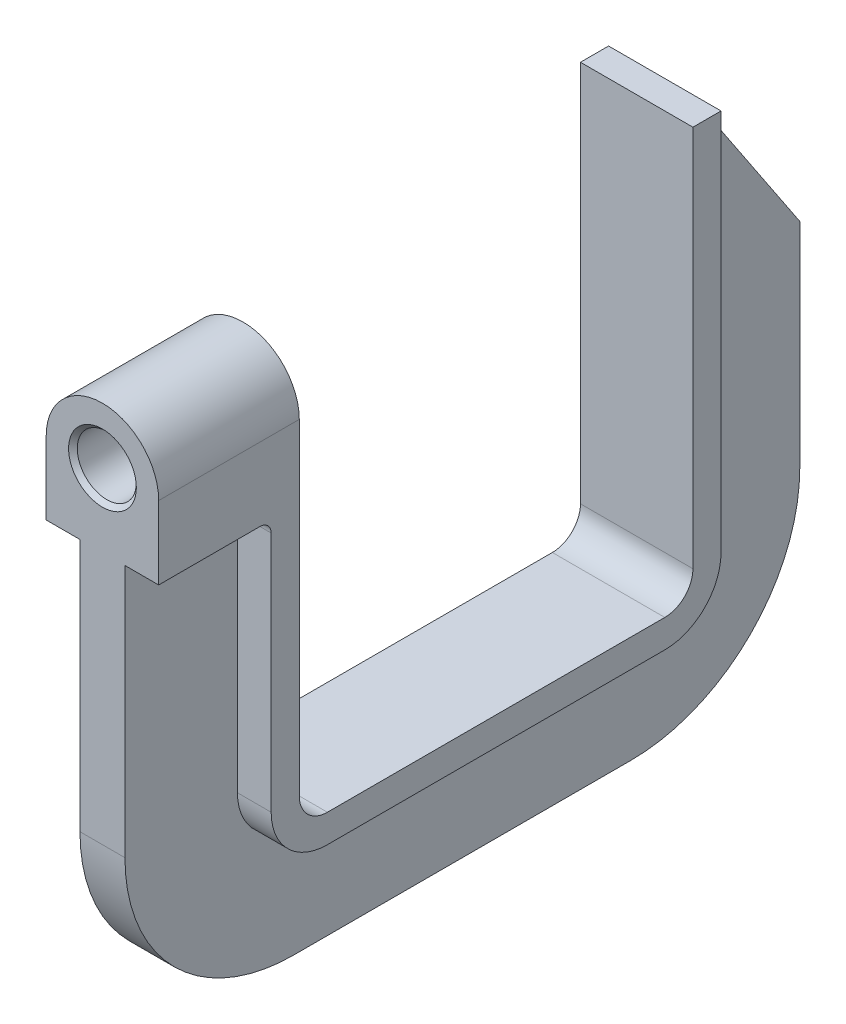
ISO-10303-21;
HEADER;
FILE_DESCRIPTION(('STEP AP214'),'2;1');
FILE_NAME('part.step','',(''),(''),'','','');
FILE_SCHEMA(('AUTOMOTIVE_DESIGN { 1 0 10303 214 1 1 1 1 }'));
ENDSEC;
DATA;
#1=APPLICATION_CONTEXT('core data for automotive mechanical design processes');
#2=APPLICATION_PROTOCOL_DEFINITION('international standard','automotive_design',2000,#1);
#3=PRODUCT_CONTEXT('',#1,'mechanical');
#4=PRODUCT('Part','Part','',(#3));
#5=PRODUCT_RELATED_PRODUCT_CATEGORY('part','',(#4));
#6=PRODUCT_DEFINITION_FORMATION('','',#4);
#7=PRODUCT_DEFINITION_CONTEXT('part definition',#1,'design');
#8=PRODUCT_DEFINITION('design','',#6,#7);
#9=PRODUCT_DEFINITION_SHAPE('','',#8);
#10=(LENGTH_UNIT() NAMED_UNIT(*) SI_UNIT(.MILLI.,.METRE.));
#11=(NAMED_UNIT(*) PLANE_ANGLE_UNIT() SI_UNIT($,.RADIAN.));
#12=(NAMED_UNIT(*) SI_UNIT($,.STERADIAN.) SOLID_ANGLE_UNIT());
#13=UNCERTAINTY_MEASURE_WITH_UNIT(LENGTH_MEASURE(1.E-05),#10,'distance_accuracy_value','');
#14=(GEOMETRIC_REPRESENTATION_CONTEXT(3) GLOBAL_UNCERTAINTY_ASSIGNED_CONTEXT((#13)) GLOBAL_UNIT_ASSIGNED_CONTEXT((#10,
#11,#12)) REPRESENTATION_CONTEXT('',''));
#15=CARTESIAN_POINT('',(0.,0.,0.));
#16=DIRECTION('',(0.,0.,1.));
#17=DIRECTION('',(1.,0.,0.));
#18=AXIS2_PLACEMENT_3D('',#15,#16,#17);
#19=CARTESIAN_POINT('',(4.,0.,95.));
#20=DIRECTION('',(0.,0.,1.));
#21=DIRECTION('',(0.,-1.,0.));
#22=AXIS2_PLACEMENT_3D('',#19,#20,#21);
#23=PLANE('',#22);
#24=CARTESIAN_POINT('',(0.,-10.,95.));
#25=DIRECTION('',(0.,0.,1.));
#26=DIRECTION('',(1.,0.,0.));
#27=AXIS2_PLACEMENT_3D('',#24,#25,#26);
#28=CIRCLE('',#27,6.025);
#29=CARTESIAN_POINT('',(6.025,-10.,95.));
#30=VERTEX_POINT('',#29);
#31=EDGE_CURVE('E638',#30,#30,#28,.T.);
#32=ORIENTED_EDGE('',*,*,#31,.F.);
#33=EDGE_LOOP('',(#32));
#34=FACE_BOUND('',#33,.T.);
#35=DIRECTION('',(0.,1.,0.));
#36=VECTOR('',#35,1.);
#37=CARTESIAN_POINT('',(10.,-23.,95.));
#38=LINE('',#37,#36);
#39=CARTESIAN_POINT('',(10.,-23.,95.));
#40=VERTEX_POINT('',#39);
#41=CARTESIAN_POINT('',(10.,-10.,95.));
#42=VERTEX_POINT('',#41);
#43=EDGE_CURVE('E596',#40,#42,#38,.T.);
#44=ORIENTED_EDGE('',*,*,#43,.T.);
#45=CARTESIAN_POINT('',(0.,-10.,95.));
#46=DIRECTION('',(0.,0.,1.));
#47=DIRECTION('',(1.,0.,0.));
#48=AXIS2_PLACEMENT_3D('',#45,#46,#47);
#49=CIRCLE('',#48,10.);
#50=CARTESIAN_POINT('',(-10.,-10.,95.));
#51=VERTEX_POINT('',#50);
#52=EDGE_CURVE('E255',#42,#51,#49,.T.);
#53=ORIENTED_EDGE('',*,*,#52,.T.);
#54=DIRECTION('',(0.,-1.,0.));
#55=VECTOR('',#54,1.);
#56=CARTESIAN_POINT('',(-10.,-10.,95.));
#57=LINE('',#56,#55);
#58=CARTESIAN_POINT('',(-10.,-23.,95.));
#59=VERTEX_POINT('',#58);
#60=EDGE_CURVE('E594',#51,#59,#57,.T.);
#61=ORIENTED_EDGE('',*,*,#60,.T.);
#62=DIRECTION('',(1.,0.,0.));
#63=VECTOR('',#62,1.);
#64=CARTESIAN_POINT('',(-10.,-23.,95.));
#65=LINE('',#64,#63);
#66=CARTESIAN_POINT('',(-4.,-23.,95.));
#67=VERTEX_POINT('',#66);
#68=EDGE_CURVE('E506',#59,#67,#65,.T.);
#69=ORIENTED_EDGE('',*,*,#68,.T.);
#70=DIRECTION('',(0.,1.,0.));
#71=VECTOR('',#70,1.);
#72=CARTESIAN_POINT('',(-4.,0.,95.));
#73=LINE('',#72,#71);
#74=CARTESIAN_POINT('',(-4.,-68.,94.9999999999999));
#75=VERTEX_POINT('',#74);
#76=EDGE_CURVE('E376',#75,#67,#73,.T.);
#77=ORIENTED_EDGE('',*,*,#76,.F.);
#78=DIRECTION('',(-1.,0.,0.));
#79=VECTOR('',#78,1.);
#80=CARTESIAN_POINT('',(4.,-68.,94.9999999999999));
#81=LINE('',#80,#79);
#82=CARTESIAN_POINT('',(4.,-68.,94.9999999999999));
#83=VERTEX_POINT('',#82);
#84=EDGE_CURVE('E411',#83,#75,#81,.T.);
#85=ORIENTED_EDGE('',*,*,#84,.F.);
#86=DIRECTION('',(0.,1.,0.));
#87=VECTOR('',#86,1.);
#88=CARTESIAN_POINT('',(4.,0.,95.));
#89=LINE('',#88,#87);
#90=CARTESIAN_POINT('',(4.,-23.,95.));
#91=VERTEX_POINT('',#90);
#92=EDGE_CURVE('E407',#83,#91,#89,.T.);
#93=ORIENTED_EDGE('',*,*,#92,.T.);
#94=EDGE_CURVE('E620',#91,#40,#65,.T.);
#95=ORIENTED_EDGE('',*,*,#94,.T.);
#96=EDGE_LOOP('',(#44,#53,#61,#69,#77,#85,#93,#95));
#97=FACE_BOUND('',#96,.T.);
#98=ADVANCED_FACE('F63',(#34,#97),#23,.T.);
#99=CARTESIAN_POINT('',(10.,0.,70.));
#100=DIRECTION('',(0.,0.,1.));
#101=DIRECTION('',(0.,-1.,0.));
#102=AXIS2_PLACEMENT_3D('',#99,#100,#101);
#103=PLANE('',#102);
#104=CARTESIAN_POINT('',(0.,-10.,70.));
#105=DIRECTION('',(0.,0.,1.));
#106=DIRECTION('',(0.,-1.,0.));
#107=AXIS2_PLACEMENT_3D('',#104,#105,#106);
#108=CIRCLE('',#107,5.25);
#109=CARTESIAN_POINT('',(0.,-15.25,70.));
#110=VERTEX_POINT('',#109);
#111=EDGE_CURVE('E271',#110,#110,#108,.T.);
#112=ORIENTED_EDGE('',*,*,#111,.T.);
#113=EDGE_LOOP('',(#112));
#114=FACE_BOUND('',#113,.T.);
#115=CARTESIAN_POINT('',(0.,-10.,70.));
#116=DIRECTION('',(0.,0.,1.));
#117=DIRECTION('',(0.,-1.,0.));
#118=AXIS2_PLACEMENT_3D('',#115,#116,#117);
#119=CIRCLE('',#118,10.);
#120=CARTESIAN_POINT('',(-10.,-10.,70.));
#121=VERTEX_POINT('',#120);
#122=CARTESIAN_POINT('',(10.,-10.,70.));
#123=VERTEX_POINT('',#122);
#124=EDGE_CURVE('E253',#121,#123,#119,.F.);
#125=ORIENTED_EDGE('',*,*,#124,.T.);
#126=DIRECTION('',(0.,1.,0.));
#127=VECTOR('',#126,1.);
#128=CARTESIAN_POINT('',(10.,0.,70.));
#129=LINE('',#128,#127);
#130=CARTESIAN_POINT('',(10.,-68.,70.));
#131=VERTEX_POINT('',#130);
#132=EDGE_CURVE('E267',#131,#123,#129,.T.);
#133=ORIENTED_EDGE('',*,*,#132,.F.);
#134=DIRECTION('',(-1.,0.,0.));
#135=VECTOR('',#134,1.);
#136=CARTESIAN_POINT('',(10.,-68.,70.));
#137=LINE('',#136,#135);
#138=CARTESIAN_POINT('',(-10.,-68.,70.));
#139=VERTEX_POINT('',#138);
#140=EDGE_CURVE('E332',#131,#139,#137,.T.);
#141=ORIENTED_EDGE('',*,*,#140,.T.);
#142=DIRECTION('',(0.,1.,0.));
#143=VECTOR('',#142,1.);
#144=CARTESIAN_POINT('',(-10.,0.,70.));
#145=LINE('',#144,#143);
#146=EDGE_CURVE('E269',#139,#121,#145,.T.);
#147=ORIENTED_EDGE('',*,*,#146,.T.);
#148=EDGE_LOOP('',(#125,#133,#141,#147));
#149=FACE_BOUND('',#148,.T.);
#150=ADVANCED_FACE('F265',(#114,#149),#103,.F.);
#151=CARTESIAN_POINT('',(10.,0.,0.));
#152=DIRECTION('',(1.,0.,0.));
#153=DIRECTION('',(0.,0.,-1.));
#154=AXIS2_PLACEMENT_3D('',#151,#152,#153);
#155=PLANE('',#154);
#156=ORIENTED_EDGE('',*,*,#132,.T.);
#157=DIRECTION('',(0.,0.,1.));
#158=VECTOR('',#157,1.);
#159=CARTESIAN_POINT('',(10.,-10.,39.5204986917437));
#160=LINE('',#159,#158);
#161=EDGE_CURVE('E249',#123,#42,#160,.T.);
#162=ORIENTED_EDGE('',*,*,#161,.T.);
#163=ORIENTED_EDGE('',*,*,#43,.F.);
#164=DIRECTION('',(0.,0.,1.));
#165=VECTOR('',#164,1.);
#166=CARTESIAN_POINT('',(10.,-23.,39.5204986917437));
#167=LINE('',#166,#165);
#168=CARTESIAN_POINT('',(10.,-23.,77.));
#169=VERTEX_POINT('',#168);
#170=EDGE_CURVE('E261',#169,#40,#167,.T.);
#171=ORIENTED_EDGE('',*,*,#170,.F.);
#172=CARTESIAN_POINT('',(10.,-25.,77.));
#173=DIRECTION('',(1.,0.,0.));
#174=DIRECTION('',(0.,0.,-1.));
#175=AXIS2_PLACEMENT_3D('',#172,#173,#174);
#176=CIRCLE('',#175,2.);
#177=CARTESIAN_POINT('',(10.,-25.,75.));
#178=VERTEX_POINT('',#177);
#179=EDGE_CURVE('E12',#169,#178,#176,.F.);
#180=ORIENTED_EDGE('',*,*,#179,.T.);
#181=DIRECTION('',(0.,1.,0.));
#182=VECTOR('',#181,1.);
#183=CARTESIAN_POINT('',(10.,0.,75.));
#184=LINE('',#183,#182);
#185=CARTESIAN_POINT('',(10.,-68.,75.));
#186=VERTEX_POINT('',#185);
#187=EDGE_CURVE('E278',#186,#178,#184,.T.);
#188=ORIENTED_EDGE('',*,*,#187,.F.);
#189=CARTESIAN_POINT('',(10.,-68.,65.));
#190=DIRECTION('',(1.,0.,0.));
#191=DIRECTION('',(0.,0.,-1.));
#192=AXIS2_PLACEMENT_3D('',#189,#190,#191);
#193=CIRCLE('',#192,10.);
#194=CARTESIAN_POINT('',(10.,-78.,65.));
#195=VERTEX_POINT('',#194);
#196=EDGE_CURVE('E327',#195,#186,#193,.F.);
#197=ORIENTED_EDGE('',*,*,#196,.F.);
#198=DIRECTION('',(0.,0.,1.));
#199=VECTOR('',#198,1.);
#200=CARTESIAN_POINT('',(10.,-78.,0.));
#201=LINE('',#200,#199);
#202=CARTESIAN_POINT('',(10.,-78.,4.99999999999998));
#203=VERTEX_POINT('',#202);
#204=EDGE_CURVE('E566',#203,#195,#201,.T.);
#205=ORIENTED_EDGE('',*,*,#204,.F.);
#206=CARTESIAN_POINT('',(10.,-68.,4.99999999999998));
#207=DIRECTION('',(1.,0.,0.));
#208=DIRECTION('',(0.,0.,-1.));
#209=AXIS2_PLACEMENT_3D('',#206,#207,#208);
#210=CIRCLE('',#209,9.99999999999999);
#211=CARTESIAN_POINT('',(10.,-68.,-5.00000000000001));
#212=VERTEX_POINT('',#211);
#213=EDGE_CURVE('E561',#212,#203,#210,.F.);
#214=ORIENTED_EDGE('',*,*,#213,.F.);
#215=DIRECTION('',(0.,-1.,0.));
#216=VECTOR('',#215,1.);
#217=CARTESIAN_POINT('',(10.,0.,-5.));
#218=LINE('',#217,#216);
#219=CARTESIAN_POINT('',(10.,0.,-5.));
#220=VERTEX_POINT('',#219);
#221=EDGE_CURVE('E556',#220,#212,#218,.T.);
#222=ORIENTED_EDGE('',*,*,#221,.F.);
#223=DIRECTION('',(0.,0.,-1.));
#224=VECTOR('',#223,1.);
#225=CARTESIAN_POINT('',(10.,0.,0.));
#226=LINE('',#225,#224);
#227=CARTESIAN_POINT('',(10.,0.,0.));
#228=VERTEX_POINT('',#227);
#229=EDGE_CURVE('E571',#228,#220,#226,.T.);
#230=ORIENTED_EDGE('',*,*,#229,.F.);
#231=DIRECTION('',(0.,-1.,0.));
#232=VECTOR('',#231,1.);
#233=CARTESIAN_POINT('',(10.,0.,0.));
#234=LINE('',#233,#232);
#235=CARTESIAN_POINT('',(10.,-68.,0.));
#236=VERTEX_POINT('',#235);
#237=EDGE_CURVE('E578',#228,#236,#234,.T.);
#238=ORIENTED_EDGE('',*,*,#237,.T.);
#239=CARTESIAN_POINT('',(10.,-68.,4.99999999999998));
#240=DIRECTION('',(1.,0.,0.));
#241=DIRECTION('',(0.,0.,-1.));
#242=AXIS2_PLACEMENT_3D('',#239,#240,#241);
#243=CIRCLE('',#242,5.);
#244=CARTESIAN_POINT('',(10.,-73.,4.99999999999998));
#245=VERTEX_POINT('',#244);
#246=EDGE_CURVE('E581',#236,#245,#243,.F.);
#247=ORIENTED_EDGE('',*,*,#246,.T.);
#248=DIRECTION('',(0.,0.,1.));
#249=VECTOR('',#248,1.);
#250=CARTESIAN_POINT('',(10.,-73.,0.));
#251=LINE('',#250,#249);
#252=CARTESIAN_POINT('',(10.,-73.,65.));
#253=VERTEX_POINT('',#252);
#254=EDGE_CURVE('E284',#245,#253,#251,.T.);
#255=ORIENTED_EDGE('',*,*,#254,.T.);
#256=CARTESIAN_POINT('',(10.,-68.,65.));
#257=DIRECTION('',(1.,0.,0.));
#258=DIRECTION('',(0.,0.,-1.));
#259=AXIS2_PLACEMENT_3D('',#256,#257,#258);
#260=CIRCLE('',#259,5.);
#261=EDGE_CURVE('E275',#253,#131,#260,.F.);
#262=ORIENTED_EDGE('',*,*,#261,.T.);
#263=EDGE_LOOP('',(#156,#162,#163,#171,#180,#188,#197,#205,#214,#222,#230,#238,#247,#255,#262));
#264=FACE_BOUND('',#263,.T.);
#265=ADVANCED_FACE('F273',(#264),#155,.T.);
#266=CARTESIAN_POINT('',(-10.,0.,0.));
#267=DIRECTION('',(1.,0.,0.));
#268=DIRECTION('',(0.,0.,-1.));
#269=AXIS2_PLACEMENT_3D('',#266,#267,#268);
#270=PLANE('',#269);
#271=DIRECTION('',(0.,0.,1.));
#272=VECTOR('',#271,1.);
#273=CARTESIAN_POINT('',(-10.,-10.,39.5204986917437));
#274=LINE('',#273,#272);
#275=EDGE_CURVE('E509',#121,#51,#274,.T.);
#276=ORIENTED_EDGE('',*,*,#275,.F.);
#277=ORIENTED_EDGE('',*,*,#146,.F.);
#278=CARTESIAN_POINT('',(-10.,-68.,65.));
#279=DIRECTION('',(1.,0.,0.));
#280=DIRECTION('',(0.,0.,-1.));
#281=AXIS2_PLACEMENT_3D('',#278,#279,#280);
#282=CIRCLE('',#281,5.);
#283=CARTESIAN_POINT('',(-10.,-73.,65.));
#284=VERTEX_POINT('',#283);
#285=EDGE_CURVE('E318',#284,#139,#282,.F.);
#286=ORIENTED_EDGE('',*,*,#285,.F.);
#287=DIRECTION('',(0.,0.,1.));
#288=VECTOR('',#287,1.);
#289=CARTESIAN_POINT('',(-10.,-73.,0.));
#290=LINE('',#289,#288);
#291=CARTESIAN_POINT('',(-10.,-73.,4.99999999999998));
#292=VERTEX_POINT('',#291);
#293=EDGE_CURVE('E315',#292,#284,#290,.T.);
#294=ORIENTED_EDGE('',*,*,#293,.F.);
#295=CARTESIAN_POINT('',(-10.,-68.,4.99999999999998));
#296=DIRECTION('',(1.,0.,0.));
#297=DIRECTION('',(0.,0.,-1.));
#298=AXIS2_PLACEMENT_3D('',#295,#296,#297);
#299=CIRCLE('',#298,5.);
#300=CARTESIAN_POINT('',(-10.,-68.,0.));
#301=VERTEX_POINT('',#300);
#302=EDGE_CURVE('E312',#301,#292,#299,.F.);
#303=ORIENTED_EDGE('',*,*,#302,.F.);
#304=DIRECTION('',(0.,-1.,0.));
#305=VECTOR('',#304,1.);
#306=CARTESIAN_POINT('',(-10.,0.,0.));
#307=LINE('',#306,#305);
#308=CARTESIAN_POINT('',(-10.,0.,0.));
#309=VERTEX_POINT('',#308);
#310=EDGE_CURVE('E309',#309,#301,#307,.T.);
#311=ORIENTED_EDGE('',*,*,#310,.F.);
#312=DIRECTION('',(0.,0.,-1.));
#313=VECTOR('',#312,1.);
#314=CARTESIAN_POINT('',(-10.,0.,0.));
#315=LINE('',#314,#313);
#316=CARTESIAN_POINT('',(-10.,0.,-5.));
#317=VERTEX_POINT('',#316);
#318=EDGE_CURVE('E305',#309,#317,#315,.T.);
#319=ORIENTED_EDGE('',*,*,#318,.T.);
#320=DIRECTION('',(0.,-1.,0.));
#321=VECTOR('',#320,1.);
#322=CARTESIAN_POINT('',(-10.,0.,-5.));
#323=LINE('',#322,#321);
#324=CARTESIAN_POINT('',(-10.,-68.,-5.00000000000001));
#325=VERTEX_POINT('',#324);
#326=EDGE_CURVE('E301',#317,#325,#323,.T.);
#327=ORIENTED_EDGE('',*,*,#326,.T.);
#328=CARTESIAN_POINT('',(-10.,-68.,4.99999999999998));
#329=DIRECTION('',(1.,0.,0.));
#330=DIRECTION('',(0.,0.,-1.));
#331=AXIS2_PLACEMENT_3D('',#328,#329,#330);
#332=CIRCLE('',#331,9.99999999999999);
#333=CARTESIAN_POINT('',(-10.,-78.,4.99999999999998));
#334=VERTEX_POINT('',#333);
#335=EDGE_CURVE('E297',#325,#334,#332,.F.);
#336=ORIENTED_EDGE('',*,*,#335,.T.);
#337=DIRECTION('',(0.,0.,1.));
#338=VECTOR('',#337,1.);
#339=CARTESIAN_POINT('',(-10.,-78.,0.));
#340=LINE('',#339,#338);
#341=CARTESIAN_POINT('',(-10.,-78.,65.));
#342=VERTEX_POINT('',#341);
#343=EDGE_CURVE('E292',#334,#342,#340,.T.);
#344=ORIENTED_EDGE('',*,*,#343,.T.);
#345=CARTESIAN_POINT('',(-10.,-68.,65.));
#346=DIRECTION('',(1.,0.,0.));
#347=DIRECTION('',(0.,0.,-1.));
#348=AXIS2_PLACEMENT_3D('',#345,#346,#347);
#349=CIRCLE('',#348,10.);
#350=CARTESIAN_POINT('',(-10.,-68.,75.));
#351=VERTEX_POINT('',#350);
#352=EDGE_CURVE('E288',#342,#351,#349,.F.);
#353=ORIENTED_EDGE('',*,*,#352,.T.);
#354=DIRECTION('',(0.,1.,0.));
#355=VECTOR('',#354,1.);
#356=CARTESIAN_POINT('',(-10.,0.,75.));
#357=LINE('',#356,#355);
#358=CARTESIAN_POINT('',(-10.,-25.,75.));
#359=VERTEX_POINT('',#358);
#360=EDGE_CURVE('E323',#351,#359,#357,.T.);
#361=ORIENTED_EDGE('',*,*,#360,.T.);
#362=CARTESIAN_POINT('',(-10.,-25.,77.));
#363=DIRECTION('',(1.,0.,0.));
#364=DIRECTION('',(0.,0.,-1.));
#365=AXIS2_PLACEMENT_3D('',#362,#363,#364);
#366=CIRCLE('',#365,2.);
#367=CARTESIAN_POINT('',(-10.,-23.,77.));
#368=VERTEX_POINT('',#367);
#369=EDGE_CURVE('E72',#359,#368,#366,.T.);
#370=ORIENTED_EDGE('',*,*,#369,.T.);
#371=DIRECTION('',(0.,0.,1.));
#372=VECTOR('',#371,1.);
#373=CARTESIAN_POINT('',(-10.,-23.,39.5204986917437));
#374=LINE('',#373,#372);
#375=EDGE_CURVE('E496',#368,#59,#374,.T.);
#376=ORIENTED_EDGE('',*,*,#375,.T.);
#377=ORIENTED_EDGE('',*,*,#60,.F.);
#378=EDGE_LOOP('',(#276,#277,#286,#294,#303,#311,#319,#327,#336,#344,#353,#361,#370,#376,#377));
#379=FACE_BOUND('',#378,.T.);
#380=ADVANCED_FACE('F494',(#379),#270,.F.);
#381=CARTESIAN_POINT('',(4.,-68.,65.));
#382=DIRECTION('',(-1.,0.,0.));
#383=DIRECTION('',(0.,0.,1.));
#384=AXIS2_PLACEMENT_3D('',#381,#382,#383);
#385=CYLINDRICAL_SURFACE('',#384,30.);
#386=CARTESIAN_POINT('',(-4.,-68.,65.));
#387=DIRECTION('',(1.,0.,0.));
#388=DIRECTION('',(0.,0.,-1.));
#389=AXIS2_PLACEMENT_3D('',#386,#387,#388);
#390=CIRCLE('',#389,30.);
#391=CARTESIAN_POINT('',(-4.,-98.,65.));
#392=VERTEX_POINT('',#391);
#393=EDGE_CURVE('E370',#392,#75,#390,.F.);
#394=ORIENTED_EDGE('',*,*,#393,.F.);
#395=DIRECTION('',(-1.,0.,0.));
#396=VECTOR('',#395,1.);
#397=CARTESIAN_POINT('',(4.,-98.,65.));
#398=LINE('',#397,#396);
#399=CARTESIAN_POINT('',(4.,-98.,65.));
#400=VERTEX_POINT('',#399);
#401=EDGE_CURVE('E469',#400,#392,#398,.T.);
#402=ORIENTED_EDGE('',*,*,#401,.F.);
#403=CARTESIAN_POINT('',(4.,-68.,65.));
#404=DIRECTION('',(1.,0.,0.));
#405=DIRECTION('',(0.,0.,-1.));
#406=AXIS2_PLACEMENT_3D('',#403,#404,#405);
#407=CIRCLE('',#406,30.);
#408=EDGE_CURVE('E371',#400,#83,#407,.F.);
#409=ORIENTED_EDGE('',*,*,#408,.T.);
#410=ORIENTED_EDGE('',*,*,#84,.T.);
#411=EDGE_LOOP('',(#394,#402,#409,#410));
#412=FACE_BOUND('',#411,.T.);
#413=ADVANCED_FACE('F651',(#412),#385,.T.);
#414=CARTESIAN_POINT('',(4.,-98.,0.));
#415=DIRECTION('',(0.,-1.,0.));
#416=DIRECTION('',(0.,0.,-1.));
#417=AXIS2_PLACEMENT_3D('',#414,#415,#416);
#418=PLANE('',#417);
#419=DIRECTION('',(0.,0.,1.));
#420=VECTOR('',#419,1.);
#421=CARTESIAN_POINT('',(-4.,-98.,0.));
#422=LINE('',#421,#420);
#423=CARTESIAN_POINT('',(-4.,-98.,4.99999999999998));
#424=VERTEX_POINT('',#423);
#425=EDGE_CURVE('E415',#424,#392,#422,.T.);
#426=ORIENTED_EDGE('',*,*,#425,.F.);
#427=DIRECTION('',(-1.,0.,0.));
#428=VECTOR('',#427,1.);
#429=CARTESIAN_POINT('',(4.,-98.,4.99999999999998));
#430=LINE('',#429,#428);
#431=CARTESIAN_POINT('',(4.,-98.,4.99999999999998));
#432=VERTEX_POINT('',#431);
#433=EDGE_CURVE('E466',#432,#424,#430,.T.);
#434=ORIENTED_EDGE('',*,*,#433,.F.);
#435=DIRECTION('',(0.,0.,1.));
#436=VECTOR('',#435,1.);
#437=CARTESIAN_POINT('',(4.,-98.,0.));
#438=LINE('',#437,#436);
#439=EDGE_CURVE('E375',#432,#400,#438,.T.);
#440=ORIENTED_EDGE('',*,*,#439,.T.);
#441=ORIENTED_EDGE('',*,*,#401,.T.);
#442=EDGE_LOOP('',(#426,#434,#440,#441));
#443=FACE_BOUND('',#442,.T.);
#444=ADVANCED_FACE('F655',(#443),#418,.T.);
#445=CARTESIAN_POINT('',(4.,-68.,4.99999999999998));
#446=DIRECTION('',(-1.,0.,0.));
#447=DIRECTION('',(0.,0.,1.));
#448=AXIS2_PLACEMENT_3D('',#445,#446,#447);
#449=CYLINDRICAL_SURFACE('',#448,30.);
#450=CARTESIAN_POINT('',(-4.,-68.,4.99999999999998));
#451=DIRECTION('',(1.,0.,0.));
#452=DIRECTION('',(0.,0.,-1.));
#453=AXIS2_PLACEMENT_3D('',#450,#451,#452);
#454=CIRCLE('',#453,30.);
#455=CARTESIAN_POINT('',(-4.,-68.,-25.));
#456=VERTEX_POINT('',#455);
#457=EDGE_CURVE('E419',#456,#424,#454,.F.);
#458=ORIENTED_EDGE('',*,*,#457,.F.);
#459=DIRECTION('',(-1.,0.,0.));
#460=VECTOR('',#459,1.);
#461=CARTESIAN_POINT('',(4.,-68.,-25.));
#462=LINE('',#461,#460);
#463=CARTESIAN_POINT('',(4.,-68.,-25.));
#464=VERTEX_POINT('',#463);
#465=EDGE_CURVE('E463',#464,#456,#462,.T.);
#466=ORIENTED_EDGE('',*,*,#465,.F.);
#467=CARTESIAN_POINT('',(4.,-68.,4.99999999999998));
#468=DIRECTION('',(1.,0.,0.));
#469=DIRECTION('',(0.,0.,-1.));
#470=AXIS2_PLACEMENT_3D('',#467,#468,#469);
#471=CIRCLE('',#470,30.);
#472=EDGE_CURVE('E380',#464,#432,#471,.F.);
#473=ORIENTED_EDGE('',*,*,#472,.T.);
#474=ORIENTED_EDGE('',*,*,#433,.T.);
#475=EDGE_LOOP('',(#458,#466,#473,#474));
#476=FACE_BOUND('',#475,.T.);
#477=ADVANCED_FACE('F658',(#476),#449,.T.);
#478=CARTESIAN_POINT('',(4.,0.,-25.));
#479=DIRECTION('',(0.,0.,-1.));
#480=DIRECTION('',(0.,1.,0.));
#481=AXIS2_PLACEMENT_3D('',#478,#479,#480);
#482=PLANE('',#481);
#483=DIRECTION('',(0.,-1.,0.));
#484=VECTOR('',#483,1.);
#485=CARTESIAN_POINT('',(-4.,0.,-25.));
#486=LINE('',#485,#484);
#487=CARTESIAN_POINT('',(-4.,-30.,-25.));
#488=VERTEX_POINT('',#487);
#489=EDGE_CURVE('E423',#488,#456,#486,.T.);
#490=ORIENTED_EDGE('',*,*,#489,.F.);
#491=DIRECTION('',(-1.,0.,0.));
#492=VECTOR('',#491,1.);
#493=CARTESIAN_POINT('',(4.,-30.,-25.));
#494=LINE('',#493,#492);
#495=CARTESIAN_POINT('',(4.,-30.,-25.));
#496=VERTEX_POINT('',#495);
#497=EDGE_CURVE('E460',#496,#488,#494,.T.);
#498=ORIENTED_EDGE('',*,*,#497,.F.);
#499=DIRECTION('',(0.,-1.,0.));
#500=VECTOR('',#499,1.);
#501=CARTESIAN_POINT('',(4.,0.,-25.));
#502=LINE('',#501,#500);
#503=EDGE_CURVE('E384',#496,#464,#502,.T.);
#504=ORIENTED_EDGE('',*,*,#503,.T.);
#505=ORIENTED_EDGE('',*,*,#465,.T.);
#506=EDGE_LOOP('',(#490,#498,#504,#505));
#507=FACE_BOUND('',#506,.T.);
#508=ADVANCED_FACE('F661',(#507),#482,.T.);
#509=CARTESIAN_POINT('',(4.,2.30769230769231,-3.46153846153846));
#510=DIRECTION('',(0.,0.55470019622523,-0.832050294337843));
#511=DIRECTION('',(0.,0.832050294337843,0.55470019622523));
#512=AXIS2_PLACEMENT_3D('',#509,#510,#511);
#513=PLANE('',#512);
#514=DIRECTION('',(0.,-0.832050294337843,-0.55470019622523));
#515=VECTOR('',#514,1.);
#516=CARTESIAN_POINT('',(-4.,2.30769230769231,-3.46153846153846));
#517=LINE('',#516,#515);
#518=CARTESIAN_POINT('',(-4.,0.,-5.));
#519=VERTEX_POINT('',#518);
#520=EDGE_CURVE('E427',#519,#488,#517,.T.);
#521=ORIENTED_EDGE('',*,*,#520,.F.);
#522=DIRECTION('',(-1.,0.,0.));
#523=VECTOR('',#522,1.);
#524=CARTESIAN_POINT('',(4.,0.,-5.));
#525=LINE('',#524,#523);
#526=CARTESIAN_POINT('',(4.,0.,-5.));
#527=VERTEX_POINT('',#526);
#528=EDGE_CURVE('E456',#527,#519,#525,.T.);
#529=ORIENTED_EDGE('',*,*,#528,.F.);
#530=DIRECTION('',(0.,-0.832050294337843,-0.55470019622523));
#531=VECTOR('',#530,1.);
#532=CARTESIAN_POINT('',(4.,2.30769230769231,-3.46153846153846));
#533=LINE('',#532,#531);
#534=EDGE_CURVE('E388',#527,#496,#533,.T.);
#535=ORIENTED_EDGE('',*,*,#534,.T.);
#536=ORIENTED_EDGE('',*,*,#497,.T.);
#537=EDGE_LOOP('',(#521,#529,#535,#536));
#538=FACE_BOUND('',#537,.T.);
#539=ADVANCED_FACE('F545',(#538),#513,.T.);
#540=CARTESIAN_POINT('',(4.,0.,0.));
#541=DIRECTION('',(1.,0.,0.));
#542=DIRECTION('',(0.,0.,-1.));
#543=AXIS2_PLACEMENT_3D('',#540,#541,#542);
#544=PLANE('',#543);
#545=DIRECTION('',(0.,1.,0.));
#546=VECTOR('',#545,1.);
#547=CARTESIAN_POINT('',(4.,0.,75.));
#548=LINE('',#547,#546);
#549=CARTESIAN_POINT('',(4.,-68.,75.));
#550=VERTEX_POINT('',#549);
#551=CARTESIAN_POINT('',(4.,-25.,75.));
#552=VERTEX_POINT('',#551);
#553=EDGE_CURVE('E404',#550,#552,#548,.T.);
#554=ORIENTED_EDGE('',*,*,#553,.T.);
#555=CARTESIAN_POINT('',(4.,-25.,77.));
#556=DIRECTION('',(1.,0.,0.));
#557=DIRECTION('',(0.,0.,-1.));
#558=AXIS2_PLACEMENT_3D('',#555,#556,#557);
#559=CIRCLE('',#558,2.);
#560=CARTESIAN_POINT('',(4.,-23.,77.));
#561=VERTEX_POINT('',#560);
#562=EDGE_CURVE('E488',#552,#561,#559,.T.);
#563=ORIENTED_EDGE('',*,*,#562,.T.);
#564=DIRECTION('',(0.,0.,-1.));
#565=VECTOR('',#564,1.);
#566=CARTESIAN_POINT('',(4.,-23.,0.));
#567=LINE('',#566,#565);
#568=EDGE_CURVE('E260',#91,#561,#567,.T.);
#569=ORIENTED_EDGE('',*,*,#568,.F.);
#570=ORIENTED_EDGE('',*,*,#92,.F.);
#571=ORIENTED_EDGE('',*,*,#408,.F.);
#572=ORIENTED_EDGE('',*,*,#439,.F.);
#573=ORIENTED_EDGE('',*,*,#472,.F.);
#574=ORIENTED_EDGE('',*,*,#503,.F.);
#575=ORIENTED_EDGE('',*,*,#534,.F.);
#576=DIRECTION('',(0.,-1.,0.));
#577=VECTOR('',#576,1.);
#578=CARTESIAN_POINT('',(4.,0.,-5.));
#579=LINE('',#578,#577);
#580=CARTESIAN_POINT('',(4.,-68.,-5.00000000000001));
#581=VERTEX_POINT('',#580);
#582=EDGE_CURVE('E392',#527,#581,#579,.T.);
#583=ORIENTED_EDGE('',*,*,#582,.T.);
#584=CARTESIAN_POINT('',(4.,-68.,4.99999999999998));
#585=DIRECTION('',(1.,0.,0.));
#586=DIRECTION('',(0.,0.,-1.));
#587=AXIS2_PLACEMENT_3D('',#584,#585,#586);
#588=CIRCLE('',#587,9.99999999999999);
#589=CARTESIAN_POINT('',(4.,-78.,4.99999999999998));
#590=VERTEX_POINT('',#589);
#591=EDGE_CURVE('E395',#581,#590,#588,.F.);
#592=ORIENTED_EDGE('',*,*,#591,.T.);
#593=DIRECTION('',(0.,0.,1.));
#594=VECTOR('',#593,1.);
#595=CARTESIAN_POINT('',(4.,-78.,0.));
#596=LINE('',#595,#594);
#597=CARTESIAN_POINT('',(4.,-78.,65.));
#598=VERTEX_POINT('',#597);
#599=EDGE_CURVE('E398',#590,#598,#596,.T.);
#600=ORIENTED_EDGE('',*,*,#599,.T.);
#601=CARTESIAN_POINT('',(4.,-68.,65.));
#602=DIRECTION('',(1.,0.,0.));
#603=DIRECTION('',(0.,0.,-1.));
#604=AXIS2_PLACEMENT_3D('',#601,#602,#603);
#605=CIRCLE('',#604,10.);
#606=EDGE_CURVE('E401',#598,#550,#605,.F.);
#607=ORIENTED_EDGE('',*,*,#606,.T.);
#608=EDGE_LOOP('',(#554,#563,#569,#570,#571,#572,#573,#574,#575,#583,#592,#600,#607));
#609=FACE_BOUND('',#608,.T.);
#610=ADVANCED_FACE('F549',(#609),#544,.T.);
#611=CARTESIAN_POINT('',(-4.,0.,0.));
#612=DIRECTION('',(1.,0.,0.));
#613=DIRECTION('',(0.,0.,-1.));
#614=AXIS2_PLACEMENT_3D('',#611,#612,#613);
#615=PLANE('',#614);
#616=DIRECTION('',(0.,0.,-1.));
#617=VECTOR('',#616,1.);
#618=CARTESIAN_POINT('',(-4.,-23.,0.));
#619=LINE('',#618,#617);
#620=CARTESIAN_POINT('',(-4.,-23.,77.));
#621=VERTEX_POINT('',#620);
#622=EDGE_CURVE('E293',#67,#621,#619,.T.);
#623=ORIENTED_EDGE('',*,*,#622,.T.);
#624=CARTESIAN_POINT('',(-4.,-25.,77.));
#625=DIRECTION('',(1.,0.,0.));
#626=DIRECTION('',(0.,0.,-1.));
#627=AXIS2_PLACEMENT_3D('',#624,#625,#626);
#628=CIRCLE('',#627,2.);
#629=CARTESIAN_POINT('',(-4.,-25.,75.));
#630=VERTEX_POINT('',#629);
#631=EDGE_CURVE('E476',#621,#630,#628,.F.);
#632=ORIENTED_EDGE('',*,*,#631,.T.);
#633=DIRECTION('',(0.,1.,0.));
#634=VECTOR('',#633,1.);
#635=CARTESIAN_POINT('',(-4.,0.,75.));
#636=LINE('',#635,#634);
#637=CARTESIAN_POINT('',(-4.,-68.,75.));
#638=VERTEX_POINT('',#637);
#639=EDGE_CURVE('E447',#638,#630,#636,.T.);
#640=ORIENTED_EDGE('',*,*,#639,.F.);
#641=CARTESIAN_POINT('',(-4.,-68.,65.));
#642=DIRECTION('',(1.,0.,0.));
#643=DIRECTION('',(0.,0.,-1.));
#644=AXIS2_PLACEMENT_3D('',#641,#642,#643);
#645=CIRCLE('',#644,10.);
#646=CARTESIAN_POINT('',(-4.,-78.,65.));
#647=VERTEX_POINT('',#646);
#648=EDGE_CURVE('E443',#647,#638,#645,.F.);
#649=ORIENTED_EDGE('',*,*,#648,.F.);
#650=DIRECTION('',(0.,0.,1.));
#651=VECTOR('',#650,1.);
#652=CARTESIAN_POINT('',(-4.,-78.,0.));
#653=LINE('',#652,#651);
#654=CARTESIAN_POINT('',(-4.,-78.,4.99999999999998));
#655=VERTEX_POINT('',#654);
#656=EDGE_CURVE('E439',#655,#647,#653,.T.);
#657=ORIENTED_EDGE('',*,*,#656,.F.);
#658=CARTESIAN_POINT('',(-4.,-68.,4.99999999999998));
#659=DIRECTION('',(1.,0.,0.));
#660=DIRECTION('',(0.,0.,-1.));
#661=AXIS2_PLACEMENT_3D('',#658,#659,#660);
#662=CIRCLE('',#661,9.99999999999999);
#663=CARTESIAN_POINT('',(-4.,-68.,-5.00000000000001));
#664=VERTEX_POINT('',#663);
#665=EDGE_CURVE('E435',#664,#655,#662,.F.);
#666=ORIENTED_EDGE('',*,*,#665,.F.);
#667=DIRECTION('',(0.,-1.,0.));
#668=VECTOR('',#667,1.);
#669=CARTESIAN_POINT('',(-4.,0.,-5.));
#670=LINE('',#669,#668);
#671=EDGE_CURVE('E431',#519,#664,#670,.T.);
#672=ORIENTED_EDGE('',*,*,#671,.F.);
#673=ORIENTED_EDGE('',*,*,#520,.T.);
#674=ORIENTED_EDGE('',*,*,#489,.T.);
#675=ORIENTED_EDGE('',*,*,#457,.T.);
#676=ORIENTED_EDGE('',*,*,#425,.T.);
#677=ORIENTED_EDGE('',*,*,#393,.T.);
#678=ORIENTED_EDGE('',*,*,#76,.T.);
#679=EDGE_LOOP('',(#623,#632,#640,#649,#657,#666,#672,#673,#674,#675,#676,#677,#678));
#680=FACE_BOUND('',#679,.T.);
#681=ADVANCED_FACE('F513',(#680),#615,.F.);
#682=CARTESIAN_POINT('',(10.,-68.,65.));
#683=DIRECTION('',(-1.,0.,0.));
#684=DIRECTION('',(0.,0.,1.));
#685=AXIS2_PLACEMENT_3D('',#682,#683,#684);
#686=CYLINDRICAL_SURFACE('',#685,10.);
#687=ORIENTED_EDGE('',*,*,#648,.T.);
#688=DIRECTION('',(-1.,0.,0.));
#689=VECTOR('',#688,1.);
#690=CARTESIAN_POINT('',(10.,-68.,75.));
#691=LINE('',#690,#689);
#692=EDGE_CURVE('E282',#638,#351,#691,.T.);
#693=ORIENTED_EDGE('',*,*,#692,.T.);
#694=ORIENTED_EDGE('',*,*,#352,.F.);
#695=DIRECTION('',(-1.,0.,0.));
#696=VECTOR('',#695,1.);
#697=CARTESIAN_POINT('',(10.,-78.,65.));
#698=LINE('',#697,#696);
#699=EDGE_CURVE('E365',#647,#342,#698,.T.);
#700=ORIENTED_EDGE('',*,*,#699,.F.);
#701=EDGE_LOOP('',(#687,#693,#694,#700));
#702=FACE_BOUND('',#701,.T.);
#703=ADVANCED_FACE('F529',(#702),#686,.T.);
#704=CARTESIAN_POINT('',(10.,-78.,0.));
#705=DIRECTION('',(0.,-1.,0.));
#706=DIRECTION('',(0.,0.,-1.));
#707=AXIS2_PLACEMENT_3D('',#704,#705,#706);
#708=PLANE('',#707);
#709=ORIENTED_EDGE('',*,*,#656,.T.);
#710=ORIENTED_EDGE('',*,*,#699,.T.);
#711=ORIENTED_EDGE('',*,*,#343,.F.);
#712=DIRECTION('',(-1.,0.,0.));
#713=VECTOR('',#712,1.);
#714=CARTESIAN_POINT('',(10.,-78.,4.99999999999998));
#715=LINE('',#714,#713);
#716=EDGE_CURVE('E360',#655,#334,#715,.T.);
#717=ORIENTED_EDGE('',*,*,#716,.F.);
#718=EDGE_LOOP('',(#709,#710,#711,#717));
#719=FACE_BOUND('',#718,.T.);
#720=ADVANCED_FACE('F527',(#719),#708,.T.);
#721=CARTESIAN_POINT('',(10.,-68.,4.99999999999998));
#722=DIRECTION('',(-1.,0.,0.));
#723=DIRECTION('',(0.,0.,1.));
#724=AXIS2_PLACEMENT_3D('',#721,#722,#723);
#725=CYLINDRICAL_SURFACE('',#724,9.99999999999999);
#726=ORIENTED_EDGE('',*,*,#665,.T.);
#727=ORIENTED_EDGE('',*,*,#716,.T.);
#728=ORIENTED_EDGE('',*,*,#335,.F.);
#729=DIRECTION('',(-1.,0.,0.));
#730=VECTOR('',#729,1.);
#731=CARTESIAN_POINT('',(10.,-68.,-5.00000000000001));
#732=LINE('',#731,#730);
#733=EDGE_CURVE('E355',#664,#325,#732,.T.);
#734=ORIENTED_EDGE('',*,*,#733,.F.);
#735=EDGE_LOOP('',(#726,#727,#728,#734));
#736=FACE_BOUND('',#735,.T.);
#737=ADVANCED_FACE('F534',(#736),#725,.T.);
#738=CARTESIAN_POINT('',(10.,0.,-5.));
#739=DIRECTION('',(0.,0.,-1.));
#740=DIRECTION('',(0.,1.,0.));
#741=AXIS2_PLACEMENT_3D('',#738,#739,#740);
#742=PLANE('',#741);
#743=ORIENTED_EDGE('',*,*,#671,.T.);
#744=ORIENTED_EDGE('',*,*,#733,.T.);
#745=ORIENTED_EDGE('',*,*,#326,.F.);
#746=DIRECTION('',(-1.,0.,0.));
#747=VECTOR('',#746,1.);
#748=CARTESIAN_POINT('',(10.,0.,-5.));
#749=LINE('',#748,#747);
#750=EDGE_CURVE('E350',#519,#317,#749,.T.);
#751=ORIENTED_EDGE('',*,*,#750,.F.);
#752=EDGE_LOOP('',(#743,#744,#745,#751));
#753=FACE_BOUND('',#752,.T.);
#754=ADVANCED_FACE('F538',(#753),#742,.T.);
#755=CARTESIAN_POINT('',(10.,0.,75.));
#756=DIRECTION('',(0.,0.,1.));
#757=DIRECTION('',(0.,-1.,0.));
#758=AXIS2_PLACEMENT_3D('',#755,#756,#757);
#759=PLANE('',#758);
#760=ORIENTED_EDGE('',*,*,#639,.T.);
#761=DIRECTION('',(1.,0.,0.));
#762=VECTOR('',#761,1.);
#763=CARTESIAN_POINT('',(-10.,-25.,75.));
#764=LINE('',#763,#762);
#765=EDGE_CURVE('E479',#630,#359,#764,.F.);
#766=ORIENTED_EDGE('',*,*,#765,.T.);
#767=ORIENTED_EDGE('',*,*,#360,.F.);
#768=ORIENTED_EDGE('',*,*,#692,.F.);
#769=EDGE_LOOP('',(#760,#766,#767,#768));
#770=FACE_BOUND('',#769,.T.);
#771=ADVANCED_FACE('F516',(#770),#759,.T.);
#772=EDGE_CURVE('E328',#186,#550,#691,.T.);
#773=ORIENTED_EDGE('',*,*,#772,.T.);
#774=ORIENTED_EDGE('',*,*,#606,.F.);
#775=EDGE_CURVE('E366',#195,#598,#698,.T.);
#776=ORIENTED_EDGE('',*,*,#775,.F.);
#777=ORIENTED_EDGE('',*,*,#196,.T.);
#778=EDGE_LOOP('',(#773,#774,#776,#777));
#779=FACE_BOUND('',#778,.T.);
#780=ADVANCED_FACE('F609',(#779),#686,.T.);
#781=ORIENTED_EDGE('',*,*,#775,.T.);
#782=ORIENTED_EDGE('',*,*,#599,.F.);
#783=EDGE_CURVE('E361',#203,#590,#715,.T.);
#784=ORIENTED_EDGE('',*,*,#783,.F.);
#785=ORIENTED_EDGE('',*,*,#204,.T.);
#786=EDGE_LOOP('',(#781,#782,#784,#785));
#787=FACE_BOUND('',#786,.T.);
#788=ADVANCED_FACE('F720',(#787),#708,.T.);
#789=ORIENTED_EDGE('',*,*,#783,.T.);
#790=ORIENTED_EDGE('',*,*,#591,.F.);
#791=EDGE_CURVE('E356',#212,#581,#732,.T.);
#792=ORIENTED_EDGE('',*,*,#791,.F.);
#793=ORIENTED_EDGE('',*,*,#213,.T.);
#794=EDGE_LOOP('',(#789,#790,#792,#793));
#795=FACE_BOUND('',#794,.T.);
#796=ADVANCED_FACE('F560',(#795),#725,.T.);
#797=ORIENTED_EDGE('',*,*,#791,.T.);
#798=ORIENTED_EDGE('',*,*,#582,.F.);
#799=EDGE_CURVE('E351',#220,#527,#749,.T.);
#800=ORIENTED_EDGE('',*,*,#799,.F.);
#801=ORIENTED_EDGE('',*,*,#221,.T.);
#802=EDGE_LOOP('',(#797,#798,#800,#801));
#803=FACE_BOUND('',#802,.T.);
#804=ADVANCED_FACE('F553',(#803),#742,.T.);
#805=CARTESIAN_POINT('',(10.,0.,0.));
#806=DIRECTION('',(0.,1.,0.));
#807=DIRECTION('',(0.,0.,1.));
#808=AXIS2_PLACEMENT_3D('',#805,#806,#807);
#809=PLANE('',#808);
#810=ORIENTED_EDGE('',*,*,#318,.F.);
#811=DIRECTION('',(-1.,0.,0.));
#812=VECTOR('',#811,1.);
#813=CARTESIAN_POINT('',(10.,0.,0.));
#814=LINE('',#813,#812);
#815=EDGE_CURVE('E347',#228,#309,#814,.T.);
#816=ORIENTED_EDGE('',*,*,#815,.F.);
#817=ORIENTED_EDGE('',*,*,#229,.T.);
#818=ORIENTED_EDGE('',*,*,#799,.T.);
#819=ORIENTED_EDGE('',*,*,#528,.T.);
#820=ORIENTED_EDGE('',*,*,#750,.T.);
#821=EDGE_LOOP('',(#810,#816,#817,#818,#819,#820));
#822=FACE_BOUND('',#821,.T.);
#823=ADVANCED_FACE('F541',(#822),#809,.T.);
#824=CARTESIAN_POINT('',(10.,0.,0.));
#825=DIRECTION('',(0.,0.,-1.));
#826=DIRECTION('',(0.,1.,0.));
#827=AXIS2_PLACEMENT_3D('',#824,#825,#826);
#828=PLANE('',#827);
#829=ORIENTED_EDGE('',*,*,#310,.T.);
#830=DIRECTION('',(-1.,0.,0.));
#831=VECTOR('',#830,1.);
#832=CARTESIAN_POINT('',(10.,-68.,0.));
#833=LINE('',#832,#831);
#834=EDGE_CURVE('E343',#236,#301,#833,.T.);
#835=ORIENTED_EDGE('',*,*,#834,.F.);
#836=ORIENTED_EDGE('',*,*,#237,.F.);
#837=ORIENTED_EDGE('',*,*,#815,.T.);
#838=EDGE_LOOP('',(#829,#835,#836,#837));
#839=FACE_BOUND('',#838,.T.);
#840=ADVANCED_FACE('F709',(#839),#828,.F.);
#841=CARTESIAN_POINT('',(10.,-68.,4.99999999999998));
#842=DIRECTION('',(-1.,0.,0.));
#843=DIRECTION('',(0.,0.,1.));
#844=AXIS2_PLACEMENT_3D('',#841,#842,#843);
#845=CYLINDRICAL_SURFACE('',#844,5.);
#846=ORIENTED_EDGE('',*,*,#302,.T.);
#847=DIRECTION('',(-1.,0.,0.));
#848=VECTOR('',#847,1.);
#849=CARTESIAN_POINT('',(10.,-73.,4.99999999999998));
#850=LINE('',#849,#848);
#851=EDGE_CURVE('E339',#245,#292,#850,.T.);
#852=ORIENTED_EDGE('',*,*,#851,.F.);
#853=ORIENTED_EDGE('',*,*,#246,.F.);
#854=ORIENTED_EDGE('',*,*,#834,.T.);
#855=EDGE_LOOP('',(#846,#852,#853,#854));
#856=FACE_BOUND('',#855,.T.);
#857=ADVANCED_FACE('F706',(#856),#845,.F.);
#858=CARTESIAN_POINT('',(10.,-73.,0.));
#859=DIRECTION('',(0.,-1.,0.));
#860=DIRECTION('',(0.,0.,-1.));
#861=AXIS2_PLACEMENT_3D('',#858,#859,#860);
#862=PLANE('',#861);
#863=ORIENTED_EDGE('',*,*,#293,.T.);
#864=DIRECTION('',(-1.,0.,0.));
#865=VECTOR('',#864,1.);
#866=CARTESIAN_POINT('',(10.,-73.,65.));
#867=LINE('',#866,#865);
#868=EDGE_CURVE('E335',#253,#284,#867,.T.);
#869=ORIENTED_EDGE('',*,*,#868,.F.);
#870=ORIENTED_EDGE('',*,*,#254,.F.);
#871=ORIENTED_EDGE('',*,*,#851,.T.);
#872=EDGE_LOOP('',(#863,#869,#870,#871));
#873=FACE_BOUND('',#872,.T.);
#874=ADVANCED_FACE('F589',(#873),#862,.F.);
#875=CARTESIAN_POINT('',(10.,-68.,65.));
#876=DIRECTION('',(-1.,0.,0.));
#877=DIRECTION('',(0.,0.,1.));
#878=AXIS2_PLACEMENT_3D('',#875,#876,#877);
#879=CYLINDRICAL_SURFACE('',#878,5.);
#880=ORIENTED_EDGE('',*,*,#285,.T.);
#881=ORIENTED_EDGE('',*,*,#140,.F.);
#882=ORIENTED_EDGE('',*,*,#261,.F.);
#883=ORIENTED_EDGE('',*,*,#868,.T.);
#884=EDGE_LOOP('',(#880,#881,#882,#883));
#885=FACE_BOUND('',#884,.T.);
#886=ADVANCED_FACE('F593',(#885),#879,.F.);
#887=ORIENTED_EDGE('',*,*,#187,.T.);
#888=DIRECTION('',(1.,0.,0.));
#889=VECTOR('',#888,1.);
#890=CARTESIAN_POINT('',(4.,-25.,75.));
#891=LINE('',#890,#889);
#892=EDGE_CURVE('E84',#178,#552,#891,.F.);
#893=ORIENTED_EDGE('',*,*,#892,.T.);
#894=ORIENTED_EDGE('',*,*,#553,.F.);
#895=ORIENTED_EDGE('',*,*,#772,.F.);
#896=EDGE_LOOP('',(#887,#893,#894,#895));
#897=FACE_BOUND('',#896,.T.);
#898=ADVANCED_FACE('F611',(#897),#759,.T.);
#899=CARTESIAN_POINT('',(-10.,-23.,39.5204986917437));
#900=DIRECTION('',(0.,-1.,0.));
#901=DIRECTION('',(0.,0.,-1.));
#902=AXIS2_PLACEMENT_3D('',#899,#900,#901);
#903=PLANE('',#902);
#904=ORIENTED_EDGE('',*,*,#568,.T.);
#905=DIRECTION('',(1.,0.,0.));
#906=VECTOR('',#905,1.);
#907=CARTESIAN_POINT('',(10.,-23.,77.));
#908=LINE('',#907,#906);
#909=EDGE_CURVE('E482',#561,#169,#908,.T.);
#910=ORIENTED_EDGE('',*,*,#909,.T.);
#911=ORIENTED_EDGE('',*,*,#170,.T.);
#912=ORIENTED_EDGE('',*,*,#94,.F.);
#913=EDGE_LOOP('',(#904,#910,#911,#912));
#914=FACE_BOUND('',#913,.T.);
#915=ADVANCED_FACE('F618',(#914),#903,.T.);
#916=CARTESIAN_POINT('',(0.,-10.,39.5204986917437));
#917=DIRECTION('',(0.,0.,1.));
#918=DIRECTION('',(1.,0.,0.));
#919=AXIS2_PLACEMENT_3D('',#916,#917,#918);
#920=CYLINDRICAL_SURFACE('',#919,10.);
#921=ORIENTED_EDGE('',*,*,#52,.F.);
#922=ORIENTED_EDGE('',*,*,#161,.F.);
#923=ORIENTED_EDGE('',*,*,#124,.F.);
#924=ORIENTED_EDGE('',*,*,#275,.T.);
#925=EDGE_LOOP('',(#921,#922,#923,#924));
#926=FACE_BOUND('',#925,.T.);
#927=ADVANCED_FACE('F251',(#926),#920,.T.);
#928=ORIENTED_EDGE('',*,*,#375,.F.);
#929=DIRECTION('',(1.,0.,0.));
#930=VECTOR('',#929,1.);
#931=CARTESIAN_POINT('',(-4.,-23.,77.));
#932=LINE('',#931,#930);
#933=EDGE_CURVE('E472',#368,#621,#932,.T.);
#934=ORIENTED_EDGE('',*,*,#933,.T.);
#935=ORIENTED_EDGE('',*,*,#622,.F.);
#936=ORIENTED_EDGE('',*,*,#68,.F.);
#937=EDGE_LOOP('',(#928,#934,#935,#936));
#938=FACE_BOUND('',#937,.T.);
#939=ADVANCED_FACE('F503',(#938),#903,.T.);
#940=CARTESIAN_POINT('',(0.,-10.,95.));
#941=DIRECTION('',(0.,0.,1.));
#942=DIRECTION('',(1.,0.,0.));
#943=AXIS2_PLACEMENT_3D('',#940,#941,#942);
#944=CYLINDRICAL_SURFACE('',#943,5.25);
#945=ORIENTED_EDGE('',*,*,#111,.F.);
#946=EDGE_LOOP('',(#945));
#947=FACE_BOUND('',#946,.T.);
#948=CARTESIAN_POINT('',(0.,-10.,94.225));
#949=DIRECTION('',(0.,0.,1.));
#950=DIRECTION('',(1.,0.,0.));
#951=AXIS2_PLACEMENT_3D('',#948,#949,#950);
#952=CIRCLE('',#951,5.25);
#953=CARTESIAN_POINT('',(5.25,-10.,94.225));
#954=VERTEX_POINT('',#953);
#955=EDGE_CURVE('E634',#954,#954,#952,.T.);
#956=ORIENTED_EDGE('',*,*,#955,.T.);
#957=EDGE_LOOP('',(#956));
#958=FACE_BOUND('',#957,.T.);
#959=ADVANCED_FACE('F679',(#947,#958),#944,.F.);
#960=CARTESIAN_POINT('',(0.,-10.,95.));
#961=DIRECTION('',(0.,0.,1.));
#962=DIRECTION('',(1.,0.,0.));
#963=AXIS2_PLACEMENT_3D('',#960,#961,#962);
#964=CONICAL_SURFACE('',#963,6.025,0.78539816339745);
#965=ORIENTED_EDGE('',*,*,#955,.F.);
#966=EDGE_LOOP('',(#965));
#967=FACE_BOUND('',#966,.T.);
#968=ORIENTED_EDGE('',*,*,#31,.T.);
#969=EDGE_LOOP('',(#968));
#970=FACE_BOUND('',#969,.T.);
#971=ADVANCED_FACE('F643',(#967,#970),#964,.F.);
#972=CARTESIAN_POINT('',(-10.,-25.,77.));
#973=DIRECTION('',(-1.,0.,0.));
#974=DIRECTION('',(0.,0.,1.));
#975=AXIS2_PLACEMENT_3D('',#972,#973,#974);
#976=CYLINDRICAL_SURFACE('',#975,2.);
#977=ORIENTED_EDGE('',*,*,#369,.F.);
#978=ORIENTED_EDGE('',*,*,#765,.F.);
#979=ORIENTED_EDGE('',*,*,#631,.F.);
#980=ORIENTED_EDGE('',*,*,#933,.F.);
#981=EDGE_LOOP('',(#977,#978,#979,#980));
#982=FACE_BOUND('',#981,.T.);
#983=ADVANCED_FACE('F511',(#982),#976,.F.);
#984=CARTESIAN_POINT('',(-10.,-25.,77.));
#985=DIRECTION('',(-1.,0.,0.));
#986=DIRECTION('',(0.,0.,1.));
#987=AXIS2_PLACEMENT_3D('',#984,#985,#986);
#988=CYLINDRICAL_SURFACE('',#987,2.);
#989=ORIENTED_EDGE('',*,*,#562,.F.);
#990=ORIENTED_EDGE('',*,*,#892,.F.);
#991=ORIENTED_EDGE('',*,*,#179,.F.);
#992=ORIENTED_EDGE('',*,*,#909,.F.);
#993=EDGE_LOOP('',(#989,#990,#991,#992));
#994=FACE_BOUND('',#993,.T.);
#995=ADVANCED_FACE('F65',(#994),#988,.F.);
#996=CLOSED_SHELL('',(#98,#150,#265,#380,#413,#444,#477,#508,#539,#610,#681,#703,#720,#737,#754,
#771,#780,#788,#796,#804,#823,#840,#857,#874,#886,#898,#915,#927,#939,#959,#971,#983,#995));
#997=MANIFOLD_SOLID_BREP('B2',#996);
#998=ADVANCED_BREP_SHAPE_REPRESENTATION('',(#18,#997),#14);
#999=SHAPE_DEFINITION_REPRESENTATION(#9,#998);
ENDSEC;
END-ISO-10303-21;
